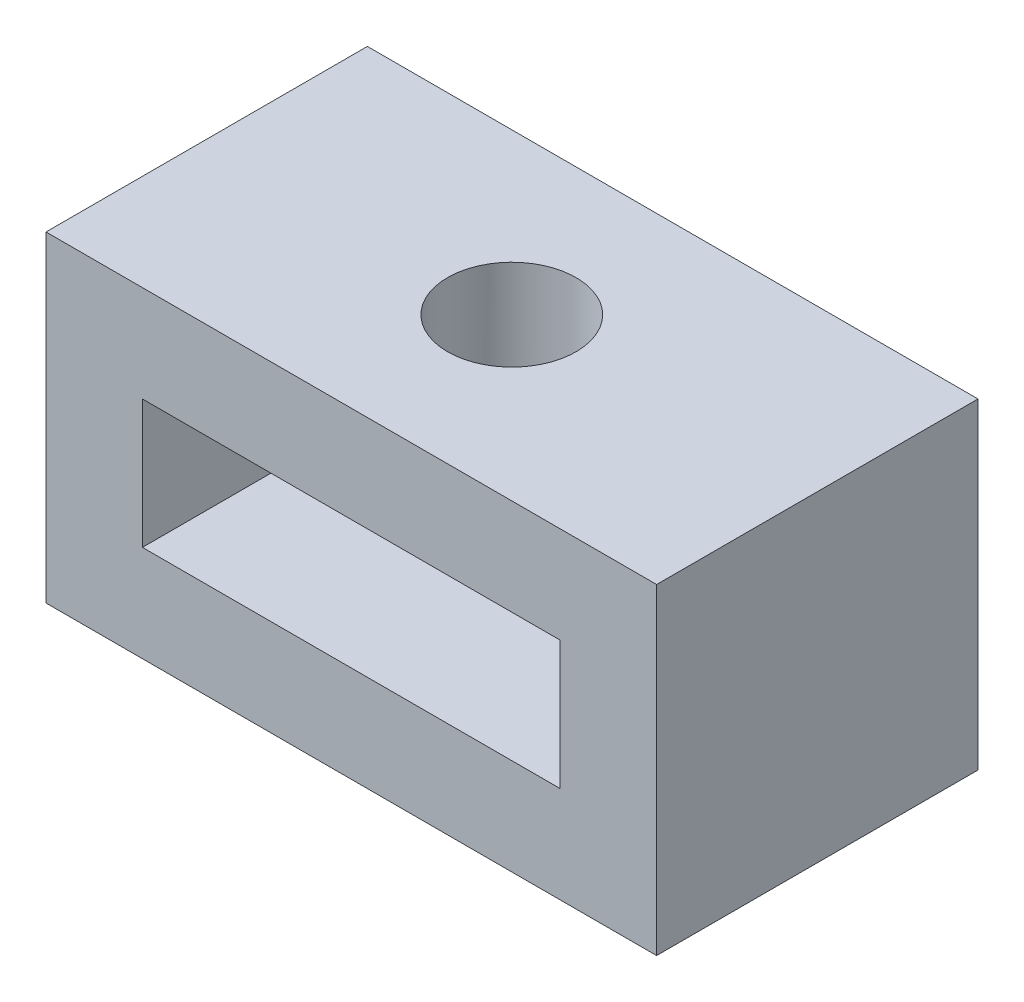
ISO-10303-21;
HEADER;
FILE_DESCRIPTION(('STEP AP214'),'2;1');
FILE_NAME('part.step','',(''),(''),'','','');
FILE_SCHEMA(('AUTOMOTIVE_DESIGN { 1 0 10303 214 1 1 1 1 }'));
ENDSEC;
DATA;
#1=APPLICATION_CONTEXT('core data for automotive mechanical design processes');
#2=APPLICATION_PROTOCOL_DEFINITION('international standard','automotive_design',2000,#1);
#3=PRODUCT_CONTEXT('',#1,'mechanical');
#4=PRODUCT('Part','Part','',(#3));
#5=PRODUCT_RELATED_PRODUCT_CATEGORY('part','',(#4));
#6=PRODUCT_DEFINITION_FORMATION('','',#4);
#7=PRODUCT_DEFINITION_CONTEXT('part definition',#1,'design');
#8=PRODUCT_DEFINITION('design','',#6,#7);
#9=PRODUCT_DEFINITION_SHAPE('','',#8);
#10=(LENGTH_UNIT() NAMED_UNIT(*) SI_UNIT(.MILLI.,.METRE.));
#11=(NAMED_UNIT(*) PLANE_ANGLE_UNIT() SI_UNIT($,.RADIAN.));
#12=(NAMED_UNIT(*) SI_UNIT($,.STERADIAN.) SOLID_ANGLE_UNIT());
#13=UNCERTAINTY_MEASURE_WITH_UNIT(LENGTH_MEASURE(1.E-05),#10,'distance_accuracy_value','');
#14=(GEOMETRIC_REPRESENTATION_CONTEXT(3) GLOBAL_UNCERTAINTY_ASSIGNED_CONTEXT((#13)) GLOBAL_UNIT_ASSIGNED_CONTEXT((#10,
#11,#12)) REPRESENTATION_CONTEXT('',''));
#15=CARTESIAN_POINT('',(0.,0.,0.));
#16=DIRECTION('',(0.,0.,1.));
#17=DIRECTION('',(1.,0.,0.));
#18=AXIS2_PLACEMENT_3D('',#15,#16,#17);
#19=CARTESIAN_POINT('',(0.,0.,10.));
#20=DIRECTION('',(0.,0.,-1.));
#21=DIRECTION('',(-1.,0.,0.));
#22=AXIS2_PLACEMENT_3D('',#19,#20,#21);
#23=PLANE('',#22);
#24=DIRECTION('',(0.,1.,0.));
#25=VECTOR('',#24,1.);
#26=CARTESIAN_POINT('',(43.6966908872964,33.5855321832291,10.));
#27=LINE('',#26,#25);
#28=CARTESIAN_POINT('',(43.6966908872964,33.5855321832291,10.));
#29=VERTEX_POINT('',#28);
#30=CARTESIAN_POINT('',(43.6966908872964,43.5855321832291,10.));
#31=VERTEX_POINT('',#30);
#32=EDGE_CURVE('E136',#29,#31,#27,.T.);
#33=ORIENTED_EDGE('',*,*,#32,.T.);
#34=DIRECTION('',(-1.,0.,0.));
#35=VECTOR('',#34,1.);
#36=CARTESIAN_POINT('',(24.6966908872964,43.5855321832291,10.));
#37=LINE('',#36,#35);
#38=CARTESIAN_POINT('',(24.6966908872964,43.5855321832291,10.));
#39=VERTEX_POINT('',#38);
#40=EDGE_CURVE('E139',#31,#39,#37,.T.);
#41=ORIENTED_EDGE('',*,*,#40,.T.);
#42=DIRECTION('',(0.,-1.,0.));
#43=VECTOR('',#42,1.);
#44=CARTESIAN_POINT('',(24.6966908872964,33.5855321832291,10.));
#45=LINE('',#44,#43);
#46=CARTESIAN_POINT('',(24.6966908872964,33.5855321832291,10.));
#47=VERTEX_POINT('',#46);
#48=EDGE_CURVE('E142',#39,#47,#45,.T.);
#49=ORIENTED_EDGE('',*,*,#48,.T.);
#50=DIRECTION('',(1.,0.,0.));
#51=VECTOR('',#50,1.);
#52=CARTESIAN_POINT('',(24.6966908872964,33.5855321832291,10.));
#53=LINE('',#52,#51);
#54=EDGE_CURVE('E144',#47,#29,#53,.T.);
#55=ORIENTED_EDGE('',*,*,#54,.T.);
#56=EDGE_LOOP('',(#33,#41,#49,#55));
#57=FACE_BOUND('',#56,.T.);
#58=DIRECTION('',(0.,1.,0.));
#59=VECTOR('',#58,1.);
#60=CARTESIAN_POINT('',(40.6966908872964,40.5855321832291,10.));
#61=LINE('',#60,#59);
#62=CARTESIAN_POINT('',(40.6966908872964,36.5855321832291,10.));
#63=VERTEX_POINT('',#62);
#64=CARTESIAN_POINT('',(40.6966908872964,40.5855321832291,10.));
#65=VERTEX_POINT('',#64);
#66=EDGE_CURVE('E99',#63,#65,#61,.T.);
#67=ORIENTED_EDGE('',*,*,#66,.F.);
#68=DIRECTION('',(1.,0.,0.));
#69=VECTOR('',#68,1.);
#70=CARTESIAN_POINT('',(27.6966908872964,36.5855321832291,10.));
#71=LINE('',#70,#69);
#72=CARTESIAN_POINT('',(27.6966908872964,36.5855321832291,10.));
#73=VERTEX_POINT('',#72);
#74=EDGE_CURVE('E121',#73,#63,#71,.T.);
#75=ORIENTED_EDGE('',*,*,#74,.F.);
#76=DIRECTION('',(0.,-1.,0.));
#77=VECTOR('',#76,1.);
#78=CARTESIAN_POINT('',(27.6966908872964,40.5855321832291,10.));
#79=LINE('',#78,#77);
#80=CARTESIAN_POINT('',(27.6966908872964,40.5855321832291,10.));
#81=VERTEX_POINT('',#80);
#82=EDGE_CURVE('E119',#81,#73,#79,.T.);
#83=ORIENTED_EDGE('',*,*,#82,.F.);
#84=DIRECTION('',(-1.,0.,0.));
#85=VECTOR('',#84,1.);
#86=CARTESIAN_POINT('',(27.6966908872964,40.5855321832291,10.));
#87=LINE('',#86,#85);
#88=EDGE_CURVE('E107',#65,#81,#87,.T.);
#89=ORIENTED_EDGE('',*,*,#88,.F.);
#90=EDGE_LOOP('',(#67,#75,#83,#89));
#91=FACE_BOUND('',#90,.T.);
#92=ADVANCED_FACE('F33',(#57,#91),#23,.F.);
#93=CARTESIAN_POINT('',(0.,0.,0.));
#94=DIRECTION('',(0.,0.,-1.));
#95=DIRECTION('',(-1.,0.,0.));
#96=AXIS2_PLACEMENT_3D('',#93,#94,#95);
#97=PLANE('',#96);
#98=DIRECTION('',(0.,1.,0.));
#99=VECTOR('',#98,1.);
#100=CARTESIAN_POINT('',(43.6966908872964,33.5855321832291,0.));
#101=LINE('',#100,#99);
#102=CARTESIAN_POINT('',(43.6966908872964,33.5855321832291,0.));
#103=VERTEX_POINT('',#102);
#104=CARTESIAN_POINT('',(43.6966908872964,43.5855321832291,0.));
#105=VERTEX_POINT('',#104);
#106=EDGE_CURVE('E115',#103,#105,#101,.T.);
#107=ORIENTED_EDGE('',*,*,#106,.F.);
#108=DIRECTION('',(1.,0.,0.));
#109=VECTOR('',#108,1.);
#110=CARTESIAN_POINT('',(24.6966908872964,33.5855321832291,0.));
#111=LINE('',#110,#109);
#112=CARTESIAN_POINT('',(24.6966908872964,33.5855321832291,0.));
#113=VERTEX_POINT('',#112);
#114=EDGE_CURVE('E140',#113,#103,#111,.T.);
#115=ORIENTED_EDGE('',*,*,#114,.F.);
#116=DIRECTION('',(0.,-1.,0.));
#117=VECTOR('',#116,1.);
#118=CARTESIAN_POINT('',(24.6966908872964,33.5855321832291,0.));
#119=LINE('',#118,#117);
#120=CARTESIAN_POINT('',(24.6966908872964,43.5855321832291,0.));
#121=VERTEX_POINT('',#120);
#122=EDGE_CURVE('E151',#121,#113,#119,.T.);
#123=ORIENTED_EDGE('',*,*,#122,.F.);
#124=DIRECTION('',(-1.,0.,0.));
#125=VECTOR('',#124,1.);
#126=CARTESIAN_POINT('',(24.6966908872964,43.5855321832291,0.));
#127=LINE('',#126,#125);
#128=EDGE_CURVE('E149',#105,#121,#127,.T.);
#129=ORIENTED_EDGE('',*,*,#128,.F.);
#130=EDGE_LOOP('',(#107,#115,#123,#129));
#131=FACE_BOUND('',#130,.T.);
#132=DIRECTION('',(1.,0.,0.));
#133=VECTOR('',#132,1.);
#134=CARTESIAN_POINT('',(27.6966908872964,36.5855321832291,0.));
#135=LINE('',#134,#133);
#136=CARTESIAN_POINT('',(27.6966908872964,36.5855321832291,0.));
#137=VERTEX_POINT('',#136);
#138=CARTESIAN_POINT('',(40.6966908872964,36.5855321832291,0.));
#139=VERTEX_POINT('',#138);
#140=EDGE_CURVE('E108',#137,#139,#135,.T.);
#141=ORIENTED_EDGE('',*,*,#140,.T.);
#142=DIRECTION('',(0.,1.,0.));
#143=VECTOR('',#142,1.);
#144=CARTESIAN_POINT('',(40.6966908872964,40.5855321832291,0.));
#145=LINE('',#144,#143);
#146=CARTESIAN_POINT('',(40.6966908872964,40.5855321832291,0.));
#147=VERTEX_POINT('',#146);
#148=EDGE_CURVE('E57',#139,#147,#145,.T.);
#149=ORIENTED_EDGE('',*,*,#148,.T.);
#150=DIRECTION('',(-1.,0.,0.));
#151=VECTOR('',#150,1.);
#152=CARTESIAN_POINT('',(27.6966908872964,40.5855321832291,0.));
#153=LINE('',#152,#151);
#154=CARTESIAN_POINT('',(27.6966908872964,40.5855321832291,0.));
#155=VERTEX_POINT('',#154);
#156=EDGE_CURVE('E114',#147,#155,#153,.T.);
#157=ORIENTED_EDGE('',*,*,#156,.T.);
#158=DIRECTION('',(0.,-1.,0.));
#159=VECTOR('',#158,1.);
#160=CARTESIAN_POINT('',(27.6966908872964,40.5855321832291,0.));
#161=LINE('',#160,#159);
#162=EDGE_CURVE('E128',#155,#137,#161,.T.);
#163=ORIENTED_EDGE('',*,*,#162,.T.);
#164=EDGE_LOOP('',(#141,#149,#157,#163));
#165=FACE_BOUND('',#164,.T.);
#166=ADVANCED_FACE('F170',(#131,#165),#97,.T.);
#167=CARTESIAN_POINT('',(43.6966908872964,33.5855321832291,10.));
#168=DIRECTION('',(-1.,0.,0.));
#169=DIRECTION('',(0.,0.,1.));
#170=AXIS2_PLACEMENT_3D('',#167,#168,#169);
#171=PLANE('',#170);
#172=ORIENTED_EDGE('',*,*,#106,.T.);
#173=DIRECTION('',(0.,0.,-1.));
#174=VECTOR('',#173,1.);
#175=CARTESIAN_POINT('',(43.6966908872964,43.5855321832291,10.));
#176=LINE('',#175,#174);
#177=EDGE_CURVE('E11',#31,#105,#176,.T.);
#178=ORIENTED_EDGE('',*,*,#177,.F.);
#179=ORIENTED_EDGE('',*,*,#32,.F.);
#180=DIRECTION('',(0.,0.,-1.));
#181=VECTOR('',#180,1.);
#182=CARTESIAN_POINT('',(43.6966908872964,33.5855321832291,10.));
#183=LINE('',#182,#181);
#184=EDGE_CURVE('E146',#29,#103,#183,.T.);
#185=ORIENTED_EDGE('',*,*,#184,.T.);
#186=EDGE_LOOP('',(#172,#178,#179,#185));
#187=FACE_BOUND('',#186,.T.);
#188=ADVANCED_FACE('F35',(#187),#171,.F.);
#189=CARTESIAN_POINT('',(24.6966908872964,43.5855321832291,10.));
#190=DIRECTION('',(0.,-1.,0.));
#191=DIRECTION('',(0.,0.,-1.));
#192=AXIS2_PLACEMENT_3D('',#189,#190,#191);
#193=PLANE('',#192);
#194=CARTESIAN_POINT('',(34.1727064179924,43.5855321832291,4.98201164802196));
#195=DIRECTION('',(0.,1.,0.));
#196=DIRECTION('',(0.,0.,1.));
#197=AXIS2_PLACEMENT_3D('',#194,#195,#196);
#198=CIRCLE('',#197,2.);
#199=CARTESIAN_POINT('',(34.1727064179924,43.5855321832291,6.98201164802196));
#200=VERTEX_POINT('',#199);
#201=EDGE_CURVE('E225',#200,#200,#198,.T.);
#202=ORIENTED_EDGE('',*,*,#201,.F.);
#203=EDGE_LOOP('',(#202));
#204=FACE_BOUND('',#203,.T.);
#205=ORIENTED_EDGE('',*,*,#128,.T.);
#206=DIRECTION('',(0.,0.,-1.));
#207=VECTOR('',#206,1.);
#208=CARTESIAN_POINT('',(24.6966908872964,43.5855321832291,10.));
#209=LINE('',#208,#207);
#210=EDGE_CURVE('E42',#39,#121,#209,.T.);
#211=ORIENTED_EDGE('',*,*,#210,.F.);
#212=ORIENTED_EDGE('',*,*,#40,.F.);
#213=ORIENTED_EDGE('',*,*,#177,.T.);
#214=EDGE_LOOP('',(#205,#211,#212,#213));
#215=FACE_BOUND('',#214,.T.);
#216=ADVANCED_FACE('F180',(#204,#215),#193,.F.);
#217=CARTESIAN_POINT('',(24.6966908872964,33.5855321832291,10.));
#218=DIRECTION('',(1.,0.,0.));
#219=DIRECTION('',(0.,0.,-1.));
#220=AXIS2_PLACEMENT_3D('',#217,#218,#219);
#221=PLANE('',#220);
#222=ORIENTED_EDGE('',*,*,#122,.T.);
#223=DIRECTION('',(0.,0.,-1.));
#224=VECTOR('',#223,1.);
#225=CARTESIAN_POINT('',(24.6966908872964,33.5855321832291,10.));
#226=LINE('',#225,#224);
#227=EDGE_CURVE('E156',#47,#113,#226,.T.);
#228=ORIENTED_EDGE('',*,*,#227,.F.);
#229=ORIENTED_EDGE('',*,*,#48,.F.);
#230=ORIENTED_EDGE('',*,*,#210,.T.);
#231=EDGE_LOOP('',(#222,#228,#229,#230));
#232=FACE_BOUND('',#231,.T.);
#233=ADVANCED_FACE('F164',(#232),#221,.F.);
#234=CARTESIAN_POINT('',(24.6966908872964,33.5855321832291,10.));
#235=DIRECTION('',(0.,1.,0.));
#236=DIRECTION('',(0.,0.,1.));
#237=AXIS2_PLACEMENT_3D('',#234,#235,#236);
#238=PLANE('',#237);
#239=ORIENTED_EDGE('',*,*,#114,.T.);
#240=ORIENTED_EDGE('',*,*,#184,.F.);
#241=ORIENTED_EDGE('',*,*,#54,.F.);
#242=ORIENTED_EDGE('',*,*,#227,.T.);
#243=EDGE_LOOP('',(#239,#240,#241,#242));
#244=FACE_BOUND('',#243,.T.);
#245=ADVANCED_FACE('F174',(#244),#238,.F.);
#246=CARTESIAN_POINT('',(40.6966908872964,40.5855321832291,10.));
#247=DIRECTION('',(-1.,0.,0.));
#248=DIRECTION('',(0.,-1.,0.));
#249=AXIS2_PLACEMENT_3D('',#246,#247,#248);
#250=PLANE('',#249);
#251=ORIENTED_EDGE('',*,*,#148,.F.);
#252=DIRECTION('',(0.,0.,-1.));
#253=VECTOR('',#252,1.);
#254=CARTESIAN_POINT('',(40.6966908872964,36.5855321832291,10.));
#255=LINE('',#254,#253);
#256=EDGE_CURVE('E103',#63,#139,#255,.T.);
#257=ORIENTED_EDGE('',*,*,#256,.F.);
#258=ORIENTED_EDGE('',*,*,#66,.T.);
#259=DIRECTION('',(0.,0.,-1.));
#260=VECTOR('',#259,1.);
#261=CARTESIAN_POINT('',(40.6966908872964,40.5855321832291,10.));
#262=LINE('',#261,#260);
#263=EDGE_CURVE('E102',#65,#147,#262,.T.);
#264=ORIENTED_EDGE('',*,*,#263,.T.);
#265=EDGE_LOOP('',(#251,#257,#258,#264));
#266=FACE_BOUND('',#265,.T.);
#267=ADVANCED_FACE('F101',(#266),#250,.T.);
#268=CARTESIAN_POINT('',(27.6966908872964,40.5855321832291,10.));
#269=DIRECTION('',(0.,-1.,0.));
#270=DIRECTION('',(0.,0.,-1.));
#271=AXIS2_PLACEMENT_3D('',#268,#269,#270);
#272=PLANE('',#271);
#273=CARTESIAN_POINT('',(34.1727064179924,40.5855321832291,4.98201164802196));
#274=DIRECTION('',(0.,-1.,0.));
#275=DIRECTION('',(0.,0.,-1.));
#276=AXIS2_PLACEMENT_3D('',#273,#274,#275);
#277=CIRCLE('',#276,2.);
#278=CARTESIAN_POINT('',(34.1727064179924,40.5855321832291,2.98201164802195));
#279=VERTEX_POINT('',#278);
#280=EDGE_CURVE('E37',#279,#279,#277,.T.);
#281=ORIENTED_EDGE('',*,*,#280,.F.);
#282=EDGE_LOOP('',(#281));
#283=FACE_BOUND('',#282,.T.);
#284=ORIENTED_EDGE('',*,*,#156,.F.);
#285=ORIENTED_EDGE('',*,*,#263,.F.);
#286=ORIENTED_EDGE('',*,*,#88,.T.);
#287=DIRECTION('',(0.,0.,-1.));
#288=VECTOR('',#287,1.);
#289=CARTESIAN_POINT('',(27.6966908872964,40.5855321832291,10.));
#290=LINE('',#289,#288);
#291=EDGE_CURVE('E116',#81,#155,#290,.T.);
#292=ORIENTED_EDGE('',*,*,#291,.T.);
#293=EDGE_LOOP('',(#284,#285,#286,#292));
#294=FACE_BOUND('',#293,.T.);
#295=ADVANCED_FACE('F111',(#283,#294),#272,.T.);
#296=CARTESIAN_POINT('',(27.6966908872964,40.5855321832291,10.));
#297=DIRECTION('',(1.,0.,0.));
#298=DIRECTION('',(0.,0.,-1.));
#299=AXIS2_PLACEMENT_3D('',#296,#297,#298);
#300=PLANE('',#299);
#301=ORIENTED_EDGE('',*,*,#162,.F.);
#302=ORIENTED_EDGE('',*,*,#291,.F.);
#303=ORIENTED_EDGE('',*,*,#82,.T.);
#304=DIRECTION('',(0.,0.,-1.));
#305=VECTOR('',#304,1.);
#306=CARTESIAN_POINT('',(27.6966908872964,36.5855321832291,10.));
#307=LINE('',#306,#305);
#308=EDGE_CURVE('E49',#73,#137,#307,.T.);
#309=ORIENTED_EDGE('',*,*,#308,.T.);
#310=EDGE_LOOP('',(#301,#302,#303,#309));
#311=FACE_BOUND('',#310,.T.);
#312=ADVANCED_FACE('F205',(#311),#300,.T.);
#313=CARTESIAN_POINT('',(27.6966908872964,36.5855321832291,10.));
#314=DIRECTION('',(0.,1.,0.));
#315=DIRECTION('',(0.,0.,1.));
#316=AXIS2_PLACEMENT_3D('',#313,#314,#315);
#317=PLANE('',#316);
#318=ORIENTED_EDGE('',*,*,#140,.F.);
#319=ORIENTED_EDGE('',*,*,#308,.F.);
#320=ORIENTED_EDGE('',*,*,#74,.T.);
#321=ORIENTED_EDGE('',*,*,#256,.T.);
#322=EDGE_LOOP('',(#318,#319,#320,#321));
#323=FACE_BOUND('',#322,.T.);
#324=ADVANCED_FACE('F210',(#323),#317,.T.);
#325=CARTESIAN_POINT('',(34.1727064179924,39.5855321832291,4.98201164802196));
#326=DIRECTION('',(0.,1.,0.));
#327=DIRECTION('',(0.,0.,1.));
#328=AXIS2_PLACEMENT_3D('',#325,#326,#327);
#329=CYLINDRICAL_SURFACE('',#328,2.);
#330=ORIENTED_EDGE('',*,*,#280,.T.);
#331=EDGE_LOOP('',(#330));
#332=FACE_BOUND('',#331,.T.);
#333=ORIENTED_EDGE('',*,*,#201,.T.);
#334=EDGE_LOOP('',(#333));
#335=FACE_BOUND('',#334,.T.);
#336=ADVANCED_FACE('F217',(#332,#335),#329,.F.);
#337=CLOSED_SHELL('',(#92,#166,#188,#216,#233,#245,#267,#295,#312,#324,#336));
#338=MANIFOLD_SOLID_BREP('B2',#337);
#339=ADVANCED_BREP_SHAPE_REPRESENTATION('',(#18,#338),#14);
#340=SHAPE_DEFINITION_REPRESENTATION(#9,#339);
ENDSEC;
END-ISO-10303-21;
